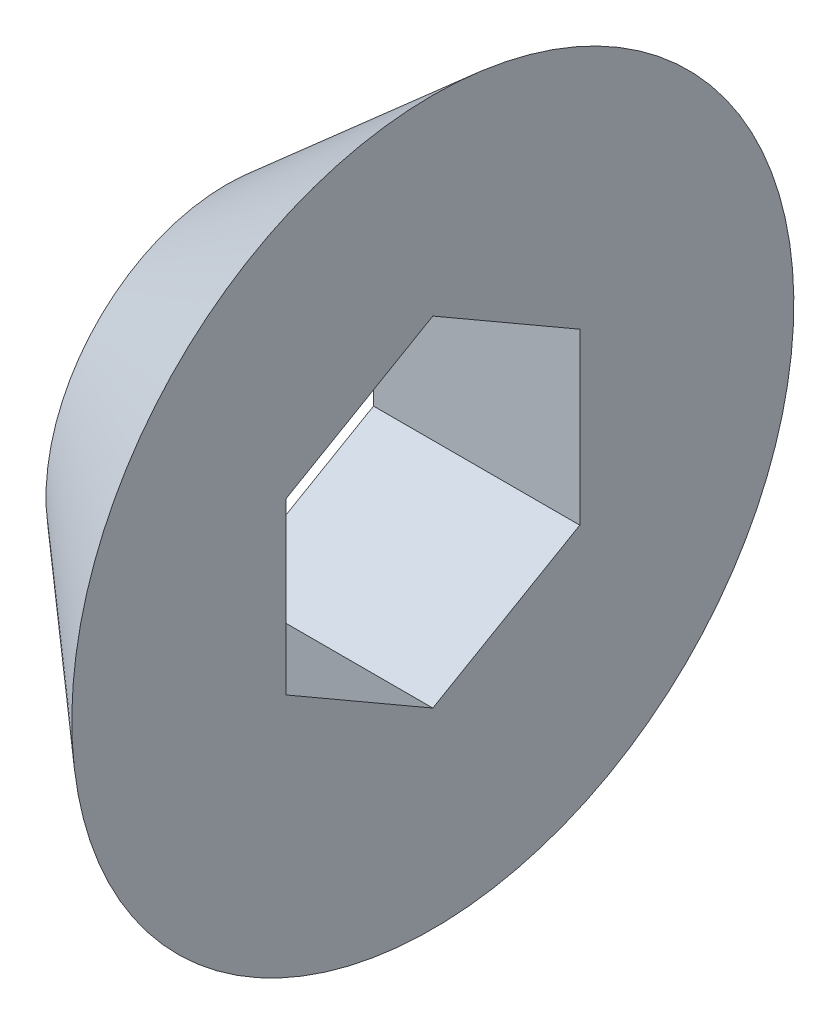
ISO-10303-21;
HEADER;
FILE_DESCRIPTION(('STEP AP214'),'2;1');
FILE_NAME('part.step','',(''),(''),'','','');
FILE_SCHEMA(('AUTOMOTIVE_DESIGN { 1 0 10303 214 1 1 1 1 }'));
ENDSEC;
DATA;
#1=APPLICATION_CONTEXT('core data for automotive mechanical design processes');
#2=APPLICATION_PROTOCOL_DEFINITION('international standard','automotive_design',2000,#1);
#3=PRODUCT_CONTEXT('',#1,'mechanical');
#4=PRODUCT('Part','Part','',(#3));
#5=PRODUCT_RELATED_PRODUCT_CATEGORY('part','',(#4));
#6=PRODUCT_DEFINITION_FORMATION('','',#4);
#7=PRODUCT_DEFINITION_CONTEXT('part definition',#1,'design');
#8=PRODUCT_DEFINITION('design','',#6,#7);
#9=PRODUCT_DEFINITION_SHAPE('','',#8);
#10=(LENGTH_UNIT() NAMED_UNIT(*) SI_UNIT(.MILLI.,.METRE.));
#11=(NAMED_UNIT(*) PLANE_ANGLE_UNIT() SI_UNIT($,.RADIAN.));
#12=(NAMED_UNIT(*) SI_UNIT($,.STERADIAN.) SOLID_ANGLE_UNIT());
#13=UNCERTAINTY_MEASURE_WITH_UNIT(LENGTH_MEASURE(1.E-05),#10,'distance_accuracy_value','');
#14=(GEOMETRIC_REPRESENTATION_CONTEXT(3) GLOBAL_UNCERTAINTY_ASSIGNED_CONTEXT((#13)) GLOBAL_UNIT_ASSIGNED_CONTEXT((#10,
#11,#12)) REPRESENTATION_CONTEXT('',''));
#15=CARTESIAN_POINT('',(0.,0.,0.));
#16=DIRECTION('',(0.,0.,1.));
#17=DIRECTION('',(1.,0.,0.));
#18=AXIS2_PLACEMENT_3D('',#15,#16,#17);
#19=CARTESIAN_POINT('',(0.,7.,0.));
#20=DIRECTION('',(1.,0.,0.));
#21=DIRECTION('',(0.,1.,0.));
#22=AXIS2_PLACEMENT_3D('',#19,#20,#21);
#23=PLANE('',#22);
#24=DIRECTION('',(0.,0.5,-0.866025403784439));
#25=VECTOR('',#24,1.);
#26=CARTESIAN_POINT('',(0.,1.64544826719043,2.85));
#27=LINE('',#26,#25);
#28=CARTESIAN_POINT('',(0.,1.64544826719043,2.85));
#29=VERTEX_POINT('',#28);
#30=CARTESIAN_POINT('',(0.,3.29089653438087,0.));
#31=VERTEX_POINT('',#30);
#32=EDGE_CURVE('E95',#29,#31,#27,.T.);
#33=ORIENTED_EDGE('',*,*,#32,.T.);
#34=DIRECTION('',(0.,-0.5,-0.866025403784439));
#35=VECTOR('',#34,1.);
#36=CARTESIAN_POINT('',(0.,3.29089653438087,0.));
#37=LINE('',#36,#35);
#38=CARTESIAN_POINT('',(0.,1.64544826719043,-2.85));
#39=VERTEX_POINT('',#38);
#40=EDGE_CURVE('E104',#31,#39,#37,.T.);
#41=ORIENTED_EDGE('',*,*,#40,.T.);
#42=DIRECTION('',(0.,-1.,0.));
#43=VECTOR('',#42,1.);
#44=CARTESIAN_POINT('',(0.,1.64544826719043,-2.85));
#45=LINE('',#44,#43);
#46=CARTESIAN_POINT('',(0.,-1.64544826719043,-2.85));
#47=VERTEX_POINT('',#46);
#48=EDGE_CURVE('E55',#39,#47,#45,.T.);
#49=ORIENTED_EDGE('',*,*,#48,.T.);
#50=DIRECTION('',(0.,-0.5,0.866025403784438));
#51=VECTOR('',#50,1.);
#52=CARTESIAN_POINT('',(0.,-1.64544826719043,-2.85));
#53=LINE('',#52,#51);
#54=CARTESIAN_POINT('',(0.,-3.29089653438087,0.));
#55=VERTEX_POINT('',#54);
#56=EDGE_CURVE('E118',#47,#55,#53,.T.);
#57=ORIENTED_EDGE('',*,*,#56,.T.);
#58=DIRECTION('',(0.,0.5,0.866025403784439));
#59=VECTOR('',#58,1.);
#60=CARTESIAN_POINT('',(0.,-3.29089653438087,0.));
#61=LINE('',#60,#59);
#62=CARTESIAN_POINT('',(0.,-1.64544826719043,2.85));
#63=VERTEX_POINT('',#62);
#64=EDGE_CURVE('E121',#55,#63,#61,.T.);
#65=ORIENTED_EDGE('',*,*,#64,.T.);
#66=DIRECTION('',(0.,1.,0.));
#67=VECTOR('',#66,1.);
#68=CARTESIAN_POINT('',(0.,-1.64544826719043,2.85));
#69=LINE('',#68,#67);
#70=EDGE_CURVE('E101',#63,#29,#69,.T.);
#71=ORIENTED_EDGE('',*,*,#70,.T.);
#72=EDGE_LOOP('',(#33,#41,#49,#57,#65,#71));
#73=FACE_BOUND('',#72,.T.);
#74=CARTESIAN_POINT('',(0.,0.,0.));
#75=DIRECTION('',(1.,0.,0.));
#76=DIRECTION('',(0.,1.,0.));
#77=AXIS2_PLACEMENT_3D('',#74,#75,#76);
#78=CIRCLE('',#77,7.);
#79=CARTESIAN_POINT('',(0.,7.,0.));
#80=VERTEX_POINT('',#79);
#81=EDGE_CURVE('E48',#80,#80,#78,.T.);
#82=ORIENTED_EDGE('',*,*,#81,.T.);
#83=EDGE_LOOP('',(#82));
#84=FACE_BOUND('',#83,.T.);
#85=ADVANCED_FACE('F41',(#73,#84),#23,.T.);
#86=CARTESIAN_POINT('',(-4.,0.,0.));
#87=DIRECTION('',(-1.,0.,0.));
#88=DIRECTION('',(0.,-1.,0.));
#89=AXIS2_PLACEMENT_3D('',#86,#87,#88);
#90=PLANE('',#89);
#91=DIRECTION('',(0.,0.5,-0.866025403784439));
#92=VECTOR('',#91,1.);
#93=CARTESIAN_POINT('',(-4.,1.64544826719043,2.85));
#94=LINE('',#93,#92);
#95=CARTESIAN_POINT('',(-4.,1.64544826719043,2.85));
#96=VERTEX_POINT('',#95);
#97=CARTESIAN_POINT('',(-4.,3.29089653438087,0.));
#98=VERTEX_POINT('',#97);
#99=EDGE_CURVE('E63',#96,#98,#94,.T.);
#100=ORIENTED_EDGE('',*,*,#99,.F.);
#101=DIRECTION('',(0.,1.,0.));
#102=VECTOR('',#101,1.);
#103=CARTESIAN_POINT('',(-4.,-1.64544826719044,2.85));
#104=LINE('',#103,#102);
#105=CARTESIAN_POINT('',(-4.,-1.64544826719044,2.85));
#106=VERTEX_POINT('',#105);
#107=EDGE_CURVE('E111',#106,#96,#104,.T.);
#108=ORIENTED_EDGE('',*,*,#107,.F.);
#109=DIRECTION('',(0.,0.5,0.866025403784439));
#110=VECTOR('',#109,1.);
#111=CARTESIAN_POINT('',(-4.,-3.29089653438087,0.));
#112=LINE('',#111,#110);
#113=CARTESIAN_POINT('',(-4.,-3.29089653438087,0.));
#114=VERTEX_POINT('',#113);
#115=EDGE_CURVE('E114',#114,#106,#112,.T.);
#116=ORIENTED_EDGE('',*,*,#115,.F.);
#117=DIRECTION('',(0.,-0.5,0.866025403784438));
#118=VECTOR('',#117,1.);
#119=CARTESIAN_POINT('',(-4.,-1.64544826719043,-2.85));
#120=LINE('',#119,#118);
#121=CARTESIAN_POINT('',(-4.,-1.64544826719043,-2.85));
#122=VERTEX_POINT('',#121);
#123=EDGE_CURVE('E130',#122,#114,#120,.T.);
#124=ORIENTED_EDGE('',*,*,#123,.F.);
#125=DIRECTION('',(0.,-1.,0.));
#126=VECTOR('',#125,1.);
#127=CARTESIAN_POINT('',(-4.,1.64544826719043,-2.85));
#128=LINE('',#127,#126);
#129=CARTESIAN_POINT('',(-4.,1.64544826719043,-2.85));
#130=VERTEX_POINT('',#129);
#131=EDGE_CURVE('E127',#130,#122,#128,.T.);
#132=ORIENTED_EDGE('',*,*,#131,.F.);
#133=DIRECTION('',(0.,-0.5,-0.866025403784439));
#134=VECTOR('',#133,1.);
#135=CARTESIAN_POINT('',(-4.,3.29089653438087,0.));
#136=LINE('',#135,#134);
#137=EDGE_CURVE('E125',#98,#130,#136,.T.);
#138=ORIENTED_EDGE('',*,*,#137,.F.);
#139=EDGE_LOOP('',(#100,#108,#116,#124,#132,#138));
#140=FACE_BOUND('',#139,.T.);
#141=CARTESIAN_POINT('',(-4.,0.,0.));
#142=DIRECTION('',(1.,0.,0.));
#143=DIRECTION('',(0.,1.,0.));
#144=AXIS2_PLACEMENT_3D('',#141,#142,#143);
#145=CIRCLE('',#144,3.5);
#146=CARTESIAN_POINT('',(-4.,3.5,0.));
#147=VERTEX_POINT('',#146);
#148=EDGE_CURVE('E11',#147,#147,#145,.T.);
#149=ORIENTED_EDGE('',*,*,#148,.F.);
#150=EDGE_LOOP('',(#149));
#151=FACE_BOUND('',#150,.T.);
#152=ADVANCED_FACE('F148',(#140,#151),#90,.T.);
#153=CARTESIAN_POINT('',(0.,0.,0.));
#154=DIRECTION('',(1.,0.,0.));
#155=DIRECTION('',(0.,1.,0.));
#156=AXIS2_PLACEMENT_3D('',#153,#154,#155);
#157=CONICAL_SURFACE('',#156,7.,0.718829999621624);
#158=ORIENTED_EDGE('',*,*,#148,.T.);
#159=EDGE_LOOP('',(#158));
#160=FACE_BOUND('',#159,.T.);
#161=ORIENTED_EDGE('',*,*,#81,.F.);
#162=EDGE_LOOP('',(#161));
#163=FACE_BOUND('',#162,.T.);
#164=ADVANCED_FACE('F146',(#160,#163),#157,.T.);
#165=CARTESIAN_POINT('',(0.,1.64544826719043,2.85));
#166=DIRECTION('',(0.,0.866025403784439,0.5));
#167=DIRECTION('',(0.,-0.5,0.866025403784439));
#168=AXIS2_PLACEMENT_3D('',#165,#166,#167);
#169=PLANE('',#168);
#170=ORIENTED_EDGE('',*,*,#99,.T.);
#171=DIRECTION('',(-1.,0.,0.));
#172=VECTOR('',#171,1.);
#173=CARTESIAN_POINT('',(0.,3.29089653438087,0.));
#174=LINE('',#173,#172);
#175=EDGE_CURVE('E91',#31,#98,#174,.T.);
#176=ORIENTED_EDGE('',*,*,#175,.F.);
#177=ORIENTED_EDGE('',*,*,#32,.F.);
#178=DIRECTION('',(-1.,0.,0.));
#179=VECTOR('',#178,1.);
#180=CARTESIAN_POINT('',(0.,1.64544826719043,2.85));
#181=LINE('',#180,#179);
#182=EDGE_CURVE('E135',#29,#96,#181,.T.);
#183=ORIENTED_EDGE('',*,*,#182,.T.);
#184=EDGE_LOOP('',(#170,#176,#177,#183));
#185=FACE_BOUND('',#184,.T.);
#186=ADVANCED_FACE('F93',(#185),#169,.F.);
#187=CARTESIAN_POINT('',(0.,-1.64544826719043,2.85));
#188=DIRECTION('',(0.,0.,1.));
#189=DIRECTION('',(1.,0.,0.));
#190=AXIS2_PLACEMENT_3D('',#187,#188,#189);
#191=PLANE('',#190);
#192=ORIENTED_EDGE('',*,*,#107,.T.);
#193=ORIENTED_EDGE('',*,*,#182,.F.);
#194=ORIENTED_EDGE('',*,*,#70,.F.);
#195=DIRECTION('',(-1.,0.,0.));
#196=VECTOR('',#195,1.);
#197=CARTESIAN_POINT('',(0.,-1.64544826719043,2.85));
#198=LINE('',#197,#196);
#199=EDGE_CURVE('E137',#63,#106,#198,.T.);
#200=ORIENTED_EDGE('',*,*,#199,.T.);
#201=EDGE_LOOP('',(#192,#193,#194,#200));
#202=FACE_BOUND('',#201,.T.);
#203=ADVANCED_FACE('F155',(#202),#191,.F.);
#204=CARTESIAN_POINT('',(0.,-3.29089653438087,0.));
#205=DIRECTION('',(0.,-0.866025403784439,0.5));
#206=DIRECTION('',(0.,-0.5,-0.866025403784439));
#207=AXIS2_PLACEMENT_3D('',#204,#205,#206);
#208=PLANE('',#207);
#209=ORIENTED_EDGE('',*,*,#115,.T.);
#210=ORIENTED_EDGE('',*,*,#199,.F.);
#211=ORIENTED_EDGE('',*,*,#64,.F.);
#212=DIRECTION('',(-1.,0.,0.));
#213=VECTOR('',#212,1.);
#214=CARTESIAN_POINT('',(0.,-3.29089653438087,0.));
#215=LINE('',#214,#213);
#216=EDGE_CURVE('E139',#55,#114,#215,.T.);
#217=ORIENTED_EDGE('',*,*,#216,.T.);
#218=EDGE_LOOP('',(#209,#210,#211,#217));
#219=FACE_BOUND('',#218,.T.);
#220=ADVANCED_FACE('F178',(#219),#208,.F.);
#221=CARTESIAN_POINT('',(0.,-1.64544826719043,-2.85));
#222=DIRECTION('',(0.,-0.866025403784438,-0.5));
#223=DIRECTION('',(0.,0.5,-0.866025403784439));
#224=AXIS2_PLACEMENT_3D('',#221,#222,#223);
#225=PLANE('',#224);
#226=ORIENTED_EDGE('',*,*,#123,.T.);
#227=ORIENTED_EDGE('',*,*,#216,.F.);
#228=ORIENTED_EDGE('',*,*,#56,.F.);
#229=DIRECTION('',(-1.,0.,0.));
#230=VECTOR('',#229,1.);
#231=CARTESIAN_POINT('',(0.,-1.64544826719043,-2.85));
#232=LINE('',#231,#230);
#233=EDGE_CURVE('E141',#47,#122,#232,.T.);
#234=ORIENTED_EDGE('',*,*,#233,.T.);
#235=EDGE_LOOP('',(#226,#227,#228,#234));
#236=FACE_BOUND('',#235,.T.);
#237=ADVANCED_FACE('F187',(#236),#225,.F.);
#238=CARTESIAN_POINT('',(0.,1.64544826719043,-2.85));
#239=DIRECTION('',(0.,0.,-1.));
#240=DIRECTION('',(-1.,0.,0.));
#241=AXIS2_PLACEMENT_3D('',#238,#239,#240);
#242=PLANE('',#241);
#243=ORIENTED_EDGE('',*,*,#131,.T.);
#244=ORIENTED_EDGE('',*,*,#233,.F.);
#245=ORIENTED_EDGE('',*,*,#48,.F.);
#246=DIRECTION('',(-1.,0.,0.));
#247=VECTOR('',#246,1.);
#248=CARTESIAN_POINT('',(0.,1.64544826719043,-2.85));
#249=LINE('',#248,#247);
#250=EDGE_CURVE('E100',#39,#130,#249,.T.);
#251=ORIENTED_EDGE('',*,*,#250,.T.);
#252=EDGE_LOOP('',(#243,#244,#245,#251));
#253=FACE_BOUND('',#252,.T.);
#254=ADVANCED_FACE('F196',(#253),#242,.F.);
#255=CARTESIAN_POINT('',(0.,3.29089653438087,0.));
#256=DIRECTION('',(0.,0.866025403784439,-0.5));
#257=DIRECTION('',(0.,0.5,0.866025403784439));
#258=AXIS2_PLACEMENT_3D('',#255,#256,#257);
#259=PLANE('',#258);
#260=ORIENTED_EDGE('',*,*,#137,.T.);
#261=ORIENTED_EDGE('',*,*,#250,.F.);
#262=ORIENTED_EDGE('',*,*,#40,.F.);
#263=ORIENTED_EDGE('',*,*,#175,.T.);
#264=EDGE_LOOP('',(#260,#261,#262,#263));
#265=FACE_BOUND('',#264,.T.);
#266=ADVANCED_FACE('F105',(#265),#259,.F.);
#267=CLOSED_SHELL('',(#85,#152,#164,#186,#203,#220,#237,#254,#266));
#268=MANIFOLD_SOLID_BREP('B2',#267);
#269=ADVANCED_BREP_SHAPE_REPRESENTATION('',(#18,#268),#14);
#270=SHAPE_DEFINITION_REPRESENTATION(#9,#269);
ENDSEC;
END-ISO-10303-21;
